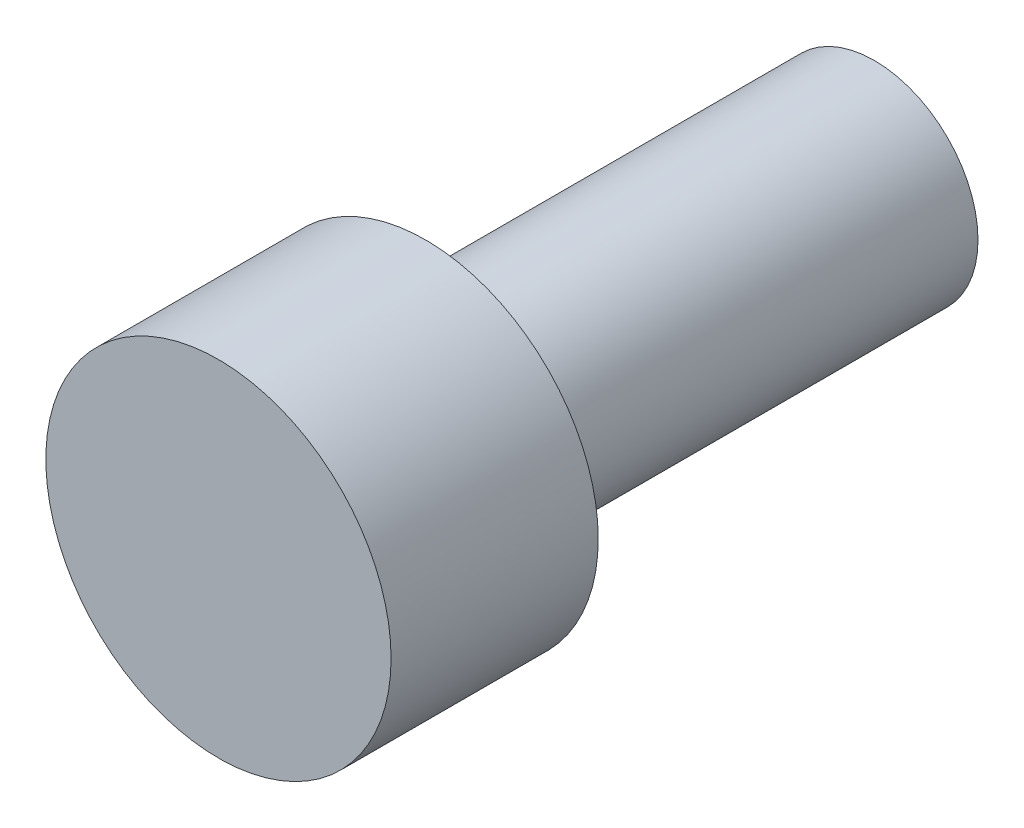
ISO-10303-21;
HEADER;
FILE_DESCRIPTION(('STEP AP214'),'2;1');
FILE_NAME('part.step','',(''),(''),'','','');
FILE_SCHEMA(('AUTOMOTIVE_DESIGN { 1 0 10303 214 1 1 1 1 }'));
ENDSEC;
DATA;
#1=APPLICATION_CONTEXT('core data for automotive mechanical design processes');
#2=APPLICATION_PROTOCOL_DEFINITION('international standard','automotive_design',2000,#1);
#3=PRODUCT_CONTEXT('',#1,'mechanical');
#4=PRODUCT('Part','Part','',(#3));
#5=PRODUCT_RELATED_PRODUCT_CATEGORY('part','',(#4));
#6=PRODUCT_DEFINITION_FORMATION('','',#4);
#7=PRODUCT_DEFINITION_CONTEXT('part definition',#1,'design');
#8=PRODUCT_DEFINITION('design','',#6,#7);
#9=PRODUCT_DEFINITION_SHAPE('','',#8);
#10=(LENGTH_UNIT() NAMED_UNIT(*) SI_UNIT(.MILLI.,.METRE.));
#11=(NAMED_UNIT(*) PLANE_ANGLE_UNIT() SI_UNIT($,.RADIAN.));
#12=(NAMED_UNIT(*) SI_UNIT($,.STERADIAN.) SOLID_ANGLE_UNIT());
#13=UNCERTAINTY_MEASURE_WITH_UNIT(LENGTH_MEASURE(1.E-05),#10,'distance_accuracy_value','');
#14=(GEOMETRIC_REPRESENTATION_CONTEXT(3) GLOBAL_UNCERTAINTY_ASSIGNED_CONTEXT((#13)) GLOBAL_UNIT_ASSIGNED_CONTEXT((#10,
#11,#12)) REPRESENTATION_CONTEXT('',''));
#15=CARTESIAN_POINT('',(0.,0.,0.));
#16=DIRECTION('',(0.,0.,1.));
#17=DIRECTION('',(1.,0.,0.));
#18=AXIS2_PLACEMENT_3D('',#15,#16,#17);
#19=CARTESIAN_POINT('',(-2.85625,0.,-18.7));
#20=DIRECTION('',(0.,0.,1.));
#21=DIRECTION('',(1.,0.,0.));
#22=AXIS2_PLACEMENT_3D('',#19,#20,#21);
#23=PLANE('',#22);
#24=CARTESIAN_POINT('',(-2.85625,0.,-18.7));
#25=DIRECTION('',(0.,0.,1.));
#26=DIRECTION('',(1.,0.,0.));
#27=AXIS2_PLACEMENT_3D('',#24,#25,#26);
#28=CIRCLE('',#27,3.);
#29=CARTESIAN_POINT('',(0.143750000000002,0.,-18.7));
#30=VERTEX_POINT('',#29);
#31=EDGE_CURVE('E10',#30,#30,#28,.T.);
#32=ORIENTED_EDGE('',*,*,#31,.F.);
#33=EDGE_LOOP('',(#32));
#34=FACE_BOUND('',#33,.T.);
#35=ADVANCED_FACE('F43',(#34),#23,.F.);
#36=CARTESIAN_POINT('',(-2.85625,0.,5.40139774864064E-13));
#37=DIRECTION('',(0.,0.,1.));
#38=DIRECTION('',(1.,0.,0.));
#39=AXIS2_PLACEMENT_3D('',#36,#37,#38);
#40=CYLINDRICAL_SURFACE('',#39,3.);
#41=CARTESIAN_POINT('',(-2.85625,0.,-5.7));
#42=DIRECTION('',(0.,0.,1.));
#43=DIRECTION('',(1.,0.,0.));
#44=AXIS2_PLACEMENT_3D('',#41,#42,#43);
#45=CIRCLE('',#44,3.);
#46=CARTESIAN_POINT('',(0.14375,0.,-5.7));
#47=VERTEX_POINT('',#46);
#48=EDGE_CURVE('E49',#47,#47,#45,.T.);
#49=ORIENTED_EDGE('',*,*,#48,.F.);
#50=EDGE_LOOP('',(#49));
#51=FACE_BOUND('',#50,.T.);
#52=ORIENTED_EDGE('',*,*,#31,.T.);
#53=EDGE_LOOP('',(#52));
#54=FACE_BOUND('',#53,.T.);
#55=ADVANCED_FACE('F80',(#51,#54),#40,.T.);
#56=CARTESIAN_POINT('',(-5.85625,0.,-5.7));
#57=DIRECTION('',(0.,0.,1.));
#58=DIRECTION('',(1.,0.,0.));
#59=AXIS2_PLACEMENT_3D('',#56,#57,#58);
#60=PLANE('',#59);
#61=CARTESIAN_POINT('',(-2.85625,0.,-5.7));
#62=DIRECTION('',(0.,0.,1.));
#63=DIRECTION('',(1.,0.,0.));
#64=AXIS2_PLACEMENT_3D('',#61,#62,#63);
#65=CIRCLE('',#64,5.);
#66=CARTESIAN_POINT('',(2.14375,0.,-5.7));
#67=VERTEX_POINT('',#66);
#68=EDGE_CURVE('E54',#67,#67,#65,.T.);
#69=ORIENTED_EDGE('',*,*,#68,.F.);
#70=EDGE_LOOP('',(#69));
#71=FACE_BOUND('',#70,.T.);
#72=ORIENTED_EDGE('',*,*,#48,.T.);
#73=EDGE_LOOP('',(#72));
#74=FACE_BOUND('',#73,.T.);
#75=ADVANCED_FACE('F75',(#71,#74),#60,.F.);
#76=CARTESIAN_POINT('',(-2.85625,0.,5.40139774864064E-13));
#77=DIRECTION('',(0.,0.,1.));
#78=DIRECTION('',(1.,0.,0.));
#79=AXIS2_PLACEMENT_3D('',#76,#77,#78);
#80=CYLINDRICAL_SURFACE('',#79,5.);
#81=CARTESIAN_POINT('',(-2.85625,0.,0.300000000000001));
#82=DIRECTION('',(0.,0.,1.));
#83=DIRECTION('',(1.,0.,0.));
#84=AXIS2_PLACEMENT_3D('',#81,#82,#83);
#85=CIRCLE('',#84,5.);
#86=CARTESIAN_POINT('',(2.14375,0.,0.300000000000001));
#87=VERTEX_POINT('',#86);
#88=EDGE_CURVE('E58',#87,#87,#85,.T.);
#89=ORIENTED_EDGE('',*,*,#88,.F.);
#90=EDGE_LOOP('',(#89));
#91=FACE_BOUND('',#90,.T.);
#92=ORIENTED_EDGE('',*,*,#68,.T.);
#93=EDGE_LOOP('',(#92));
#94=FACE_BOUND('',#93,.T.);
#95=ADVANCED_FACE('F66',(#91,#94),#80,.T.);
#96=CARTESIAN_POINT('',(-7.85625,0.,0.300000000000001));
#97=DIRECTION('',(0.,0.,-1.));
#98=DIRECTION('',(-1.,0.,0.));
#99=AXIS2_PLACEMENT_3D('',#96,#97,#98);
#100=PLANE('',#99);
#101=ORIENTED_EDGE('',*,*,#88,.T.);
#102=EDGE_LOOP('',(#101));
#103=FACE_BOUND('',#102,.T.);
#104=ADVANCED_FACE('F69',(#103),#100,.F.);
#105=CLOSED_SHELL('',(#35,#55,#75,#95,#104));
#106=MANIFOLD_SOLID_BREP('B2',#105);
#107=ADVANCED_BREP_SHAPE_REPRESENTATION('',(#18,#106),#14);
#108=SHAPE_DEFINITION_REPRESENTATION(#9,#107);
ENDSEC;
END-ISO-10303-21;
